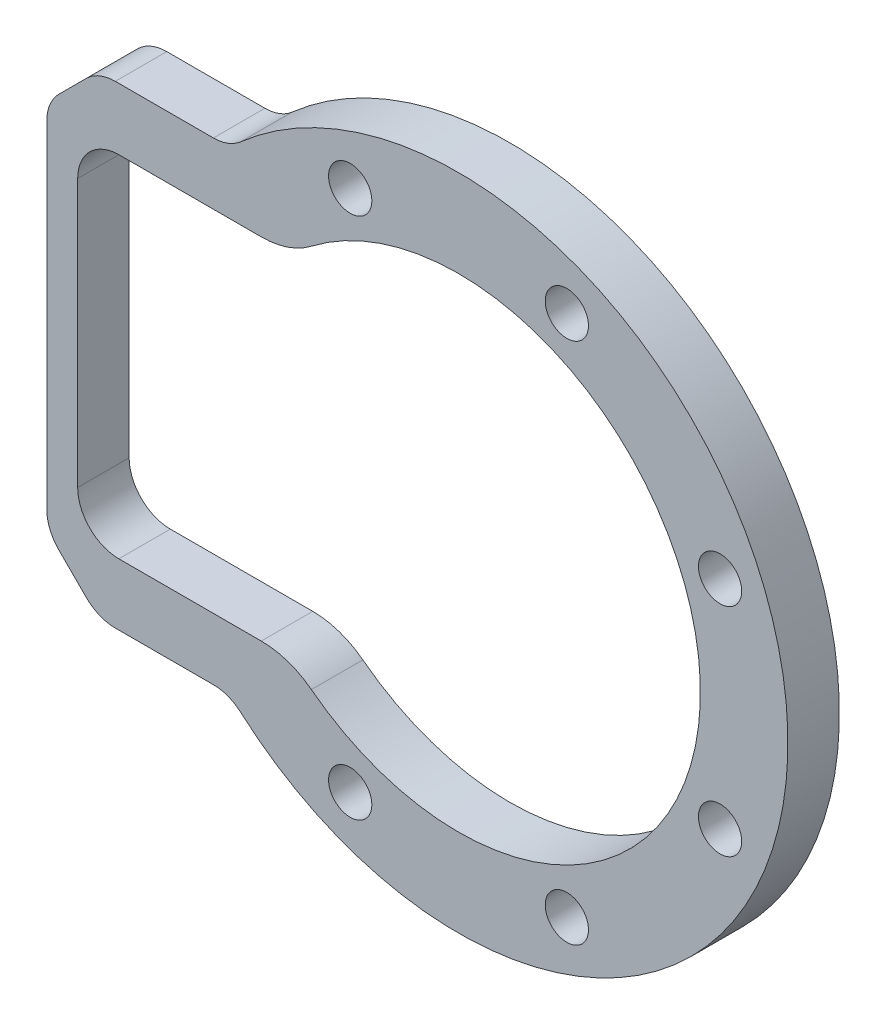
ISO-10303-21;
HEADER;
FILE_DESCRIPTION(('STEP AP214'),'2;1');
FILE_NAME('part.step','',(''),(''),'','','');
FILE_SCHEMA(('AUTOMOTIVE_DESIGN { 1 0 10303 214 1 1 1 1 }'));
ENDSEC;
DATA;
#1=APPLICATION_CONTEXT('core data for automotive mechanical design processes');
#2=APPLICATION_PROTOCOL_DEFINITION('international standard','automotive_design',2000,#1);
#3=PRODUCT_CONTEXT('',#1,'mechanical');
#4=PRODUCT('Part','Part','',(#3));
#5=PRODUCT_RELATED_PRODUCT_CATEGORY('part','',(#4));
#6=PRODUCT_DEFINITION_FORMATION('','',#4);
#7=PRODUCT_DEFINITION_CONTEXT('part definition',#1,'design');
#8=PRODUCT_DEFINITION('design','',#6,#7);
#9=PRODUCT_DEFINITION_SHAPE('','',#8);
#10=(LENGTH_UNIT() NAMED_UNIT(*) SI_UNIT(.MILLI.,.METRE.));
#11=(NAMED_UNIT(*) PLANE_ANGLE_UNIT() SI_UNIT($,.RADIAN.));
#12=(NAMED_UNIT(*) SI_UNIT($,.STERADIAN.) SOLID_ANGLE_UNIT());
#13=UNCERTAINTY_MEASURE_WITH_UNIT(LENGTH_MEASURE(1.E-05),#10,'distance_accuracy_value','');
#14=(GEOMETRIC_REPRESENTATION_CONTEXT(3) GLOBAL_UNCERTAINTY_ASSIGNED_CONTEXT((#13)) GLOBAL_UNIT_ASSIGNED_CONTEXT((#10,
#11,#12)) REPRESENTATION_CONTEXT('',''));
#15=CARTESIAN_POINT('',(0.,0.,0.));
#16=DIRECTION('',(0.,0.,1.));
#17=DIRECTION('',(1.,0.,0.));
#18=AXIS2_PLACEMENT_3D('',#15,#16,#17);
#19=CARTESIAN_POINT('',(-19.1637678967368,-25.,5.));
#20=DIRECTION('',(0.,0.,-1.));
#21=DIRECTION('',(-1.,0.,0.));
#22=AXIS2_PLACEMENT_3D('',#19,#20,#21);
#23=CYLINDRICAL_SURFACE('',#22,8.);
#24=CARTESIAN_POINT('',(-19.1637678967368,-25.,5.));
#25=DIRECTION('',(0.,0.,1.));
#26=DIRECTION('',(1.,0.,0.));
#27=AXIS2_PLACEMENT_3D('',#24,#25,#26);
#28=CIRCLE('',#27,8.);
#29=CARTESIAN_POINT('',(-14.2967792245497,-18.6507936507937,5.));
#30=VERTEX_POINT('',#29);
#31=CARTESIAN_POINT('',(-19.1637678967368,-17.,5.));
#32=VERTEX_POINT('',#31);
#33=EDGE_CURVE('E246',#30,#32,#28,.T.);
#34=ORIENTED_EDGE('',*,*,#33,.F.);
#35=DIRECTION('',(0.,0.,1.));
#36=VECTOR('',#35,1.);
#37=CARTESIAN_POINT('',(-14.2967792245497,-18.6507936507937,5.));
#38=LINE('',#37,#36);
#39=CARTESIAN_POINT('',(-14.2967792245497,-18.6507936507937,0.));
#40=VERTEX_POINT('',#39);
#41=EDGE_CURVE('E453',#40,#30,#38,.T.);
#42=ORIENTED_EDGE('',*,*,#41,.F.);
#43=CARTESIAN_POINT('',(-19.1637678967368,-25.,0.));
#44=DIRECTION('',(0.,0.,-1.));
#45=DIRECTION('',(1.,0.,0.));
#46=AXIS2_PLACEMENT_3D('',#43,#44,#45);
#47=CIRCLE('',#46,8.);
#48=CARTESIAN_POINT('',(-19.1637678967368,-17.,0.));
#49=VERTEX_POINT('',#48);
#50=EDGE_CURVE('E289',#49,#40,#47,.T.);
#51=ORIENTED_EDGE('',*,*,#50,.F.);
#52=DIRECTION('',(0.,0.,-1.));
#53=VECTOR('',#52,1.);
#54=CARTESIAN_POINT('',(-19.1637678967368,-17.,0.));
#55=LINE('',#54,#53);
#56=EDGE_CURVE('E437',#32,#49,#55,.T.);
#57=ORIENTED_EDGE('',*,*,#56,.F.);
#58=EDGE_LOOP('',(#34,#42,#51,#57));
#59=FACE_BOUND('',#58,.T.);
#60=ADVANCED_FACE('F16',(#59),#23,.T.);
#61=CARTESIAN_POINT('',(-19.1637678967368,25.,5.));
#62=DIRECTION('',(0.,0.,-1.));
#63=DIRECTION('',(-1.,0.,0.));
#64=AXIS2_PLACEMENT_3D('',#61,#62,#63);
#65=CYLINDRICAL_SURFACE('',#64,8.);
#66=CARTESIAN_POINT('',(-19.1637678967368,25.,5.));
#67=DIRECTION('',(0.,0.,1.));
#68=DIRECTION('',(1.,0.,0.));
#69=AXIS2_PLACEMENT_3D('',#66,#67,#68);
#70=CIRCLE('',#69,8.);
#71=CARTESIAN_POINT('',(-19.1637678967368,17.,5.));
#72=VERTEX_POINT('',#71);
#73=CARTESIAN_POINT('',(-14.2967792245497,18.6507936507937,5.));
#74=VERTEX_POINT('',#73);
#75=EDGE_CURVE('E242',#72,#74,#70,.T.);
#76=ORIENTED_EDGE('',*,*,#75,.F.);
#77=DIRECTION('',(0.,0.,1.));
#78=VECTOR('',#77,1.);
#79=CARTESIAN_POINT('',(-19.1637678967368,17.,5.));
#80=LINE('',#79,#78);
#81=CARTESIAN_POINT('',(-19.1637678967368,17.,0.));
#82=VERTEX_POINT('',#81);
#83=EDGE_CURVE('E350',#82,#72,#80,.T.);
#84=ORIENTED_EDGE('',*,*,#83,.F.);
#85=CARTESIAN_POINT('',(-19.1637678967368,25.,0.));
#86=DIRECTION('',(0.,0.,-1.));
#87=DIRECTION('',(1.,0.,0.));
#88=AXIS2_PLACEMENT_3D('',#85,#86,#87);
#89=CIRCLE('',#88,8.);
#90=CARTESIAN_POINT('',(-14.2967792245497,18.6507936507937,0.));
#91=VERTEX_POINT('',#90);
#92=EDGE_CURVE('E285',#91,#82,#89,.T.);
#93=ORIENTED_EDGE('',*,*,#92,.F.);
#94=DIRECTION('',(0.,0.,-1.));
#95=VECTOR('',#94,1.);
#96=CARTESIAN_POINT('',(-14.2967792245497,18.6507936507937,5.));
#97=LINE('',#96,#95);
#98=EDGE_CURVE('E467',#74,#91,#97,.T.);
#99=ORIENTED_EDGE('',*,*,#98,.F.);
#100=EDGE_LOOP('',(#76,#84,#93,#99));
#101=FACE_BOUND('',#100,.T.);
#102=ADVANCED_FACE('F1004',(#101),#65,.T.);
#103=CARTESIAN_POINT('',(-33.3431457505076,19.,5.));
#104=DIRECTION('',(0.,0.,1.));
#105=DIRECTION('',(1.,0.,0.));
#106=AXIS2_PLACEMENT_3D('',#103,#104,#105);
#107=CYLINDRICAL_SURFACE('',#106,4.);
#108=CARTESIAN_POINT('',(-33.3431457505076,19.,0.));
#109=DIRECTION('',(0.,0.,-1.));
#110=DIRECTION('',(1.,0.,0.));
#111=AXIS2_PLACEMENT_3D('',#108,#109,#110);
#112=CIRCLE('',#111,4.);
#113=CARTESIAN_POINT('',(-36.1715728752538,21.8284271247462,0.));
#114=VERTEX_POINT('',#113);
#115=CARTESIAN_POINT('',(-33.3431457505076,23.,0.));
#116=VERTEX_POINT('',#115);
#117=EDGE_CURVE('E261',#114,#116,#112,.T.);
#118=ORIENTED_EDGE('',*,*,#117,.F.);
#119=DIRECTION('',(0.,0.,-1.));
#120=VECTOR('',#119,1.);
#121=CARTESIAN_POINT('',(-36.1715728752538,21.8284271247462,0.));
#122=LINE('',#121,#120);
#123=CARTESIAN_POINT('',(-36.1715728752538,21.8284271247462,5.));
#124=VERTEX_POINT('',#123);
#125=EDGE_CURVE('E11',#124,#114,#122,.T.);
#126=ORIENTED_EDGE('',*,*,#125,.F.);
#127=CARTESIAN_POINT('',(-33.3431457505076,19.,5.));
#128=DIRECTION('',(0.,0.,1.));
#129=DIRECTION('',(1.,0.,0.));
#130=AXIS2_PLACEMENT_3D('',#127,#128,#129);
#131=CIRCLE('',#130,4.);
#132=CARTESIAN_POINT('',(-33.3431457505076,23.,5.));
#133=VERTEX_POINT('',#132);
#134=EDGE_CURVE('E312',#133,#124,#131,.T.);
#135=ORIENTED_EDGE('',*,*,#134,.F.);
#136=DIRECTION('',(0.,0.,1.));
#137=VECTOR('',#136,1.);
#138=CARTESIAN_POINT('',(-33.3431457505076,23.,5.));
#139=LINE('',#138,#137);
#140=EDGE_CURVE('E376',#116,#133,#139,.T.);
#141=ORIENTED_EDGE('',*,*,#140,.F.);
#142=EDGE_LOOP('',(#118,#126,#135,#141));
#143=FACE_BOUND('',#142,.T.);
#144=ADVANCED_FACE('F512',(#143),#107,.T.);
#145=CARTESIAN_POINT('',(-33.3431457505076,-19.,5.));
#146=DIRECTION('',(0.,0.,-1.));
#147=DIRECTION('',(-1.,0.,0.));
#148=AXIS2_PLACEMENT_3D('',#145,#146,#147);
#149=CYLINDRICAL_SURFACE('',#148,4.);
#150=CARTESIAN_POINT('',(-33.3431457505076,-19.,5.));
#151=DIRECTION('',(0.,0.,1.));
#152=DIRECTION('',(1.,0.,0.));
#153=AXIS2_PLACEMENT_3D('',#150,#151,#152);
#154=CIRCLE('',#153,4.);
#155=CARTESIAN_POINT('',(-36.1715728752539,-21.8284271247462,5.));
#156=VERTEX_POINT('',#155);
#157=CARTESIAN_POINT('',(-33.3431457505076,-23.,5.));
#158=VERTEX_POINT('',#157);
#159=EDGE_CURVE('E324',#156,#158,#154,.T.);
#160=ORIENTED_EDGE('',*,*,#159,.F.);
#161=DIRECTION('',(0.,0.,1.));
#162=VECTOR('',#161,1.);
#163=CARTESIAN_POINT('',(-36.1715728752539,-21.8284271247462,5.));
#164=LINE('',#163,#162);
#165=CARTESIAN_POINT('',(-36.1715728752539,-21.8284271247462,0.));
#166=VERTEX_POINT('',#165);
#167=EDGE_CURVE('E19',#166,#156,#164,.T.);
#168=ORIENTED_EDGE('',*,*,#167,.F.);
#169=CARTESIAN_POINT('',(-33.3431457505076,-19.,0.));
#170=DIRECTION('',(0.,0.,-1.));
#171=DIRECTION('',(1.,0.,0.));
#172=AXIS2_PLACEMENT_3D('',#169,#170,#171);
#173=CIRCLE('',#172,4.);
#174=CARTESIAN_POINT('',(-33.3431457505076,-23.,0.));
#175=VERTEX_POINT('',#174);
#176=EDGE_CURVE('E265',#175,#166,#173,.T.);
#177=ORIENTED_EDGE('',*,*,#176,.F.);
#178=DIRECTION('',(0.,0.,-1.));
#179=VECTOR('',#178,1.);
#180=CARTESIAN_POINT('',(-33.3431457505076,-23.,0.));
#181=LINE('',#180,#179);
#182=EDGE_CURVE('E401',#158,#175,#181,.T.);
#183=ORIENTED_EDGE('',*,*,#182,.F.);
#184=EDGE_LOOP('',(#160,#168,#177,#183));
#185=FACE_BOUND('',#184,.T.);
#186=ADVANCED_FACE('F534',(#185),#149,.T.);
#187=CARTESIAN_POINT('',(-36.,-16.3431457505076,5.));
#188=DIRECTION('',(0.,0.,1.));
#189=DIRECTION('',(1.,0.,0.));
#190=AXIS2_PLACEMENT_3D('',#187,#188,#189);
#191=CYLINDRICAL_SURFACE('',#190,4.);
#192=CARTESIAN_POINT('',(-36.,-16.3431457505076,0.));
#193=DIRECTION('',(0.,0.,-1.));
#194=DIRECTION('',(1.,0.,0.));
#195=AXIS2_PLACEMENT_3D('',#192,#193,#194);
#196=CIRCLE('',#195,4.);
#197=CARTESIAN_POINT('',(-38.8284271247462,-19.1715728752538,0.));
#198=VERTEX_POINT('',#197);
#199=CARTESIAN_POINT('',(-40.,-16.3431457505076,0.));
#200=VERTEX_POINT('',#199);
#201=EDGE_CURVE('E274',#198,#200,#196,.T.);
#202=ORIENTED_EDGE('',*,*,#201,.F.);
#203=DIRECTION('',(0.,0.,-1.));
#204=VECTOR('',#203,1.);
#205=CARTESIAN_POINT('',(-38.8284271247462,-19.1715728752538,0.));
#206=LINE('',#205,#204);
#207=CARTESIAN_POINT('',(-38.8284271247462,-19.1715728752538,5.));
#208=VERTEX_POINT('',#207);
#209=EDGE_CURVE('E292',#208,#198,#206,.T.);
#210=ORIENTED_EDGE('',*,*,#209,.F.);
#211=CARTESIAN_POINT('',(-36.,-16.3431457505076,5.));
#212=DIRECTION('',(0.,0.,1.));
#213=DIRECTION('',(1.,0.,0.));
#214=AXIS2_PLACEMENT_3D('',#211,#212,#213);
#215=CIRCLE('',#214,4.);
#216=CARTESIAN_POINT('',(-40.,-16.3431457505076,5.));
#217=VERTEX_POINT('',#216);
#218=EDGE_CURVE('E330',#217,#208,#215,.T.);
#219=ORIENTED_EDGE('',*,*,#218,.F.);
#220=DIRECTION('',(0.,0.,1.));
#221=VECTOR('',#220,1.);
#222=CARTESIAN_POINT('',(-40.,-16.3431457505076,5.));
#223=LINE('',#222,#221);
#224=EDGE_CURVE('E351',#200,#217,#223,.T.);
#225=ORIENTED_EDGE('',*,*,#224,.F.);
#226=EDGE_LOOP('',(#202,#210,#219,#225));
#227=FACE_BOUND('',#226,.T.);
#228=ADVANCED_FACE('F497',(#227),#191,.T.);
#229=CARTESIAN_POINT('',(-36.,16.3431457505076,5.));
#230=DIRECTION('',(0.,0.,-1.));
#231=DIRECTION('',(-1.,0.,0.));
#232=AXIS2_PLACEMENT_3D('',#229,#230,#231);
#233=CYLINDRICAL_SURFACE('',#232,4.);
#234=CARTESIAN_POINT('',(-36.,16.3431457505076,5.));
#235=DIRECTION('',(0.,0.,1.));
#236=DIRECTION('',(1.,0.,0.));
#237=AXIS2_PLACEMENT_3D('',#234,#235,#236);
#238=CIRCLE('',#237,4.);
#239=CARTESIAN_POINT('',(-38.8284271247462,19.1715728752538,5.));
#240=VERTEX_POINT('',#239);
#241=CARTESIAN_POINT('',(-40.,16.3431457505076,5.));
#242=VERTEX_POINT('',#241);
#243=EDGE_CURVE('E334',#240,#242,#238,.T.);
#244=ORIENTED_EDGE('',*,*,#243,.F.);
#245=DIRECTION('',(0.,0.,1.));
#246=VECTOR('',#245,1.);
#247=CARTESIAN_POINT('',(-38.8284271247462,19.1715728752538,5.));
#248=LINE('',#247,#246);
#249=CARTESIAN_POINT('',(-38.8284271247462,19.1715728752538,0.));
#250=VERTEX_POINT('',#249);
#251=EDGE_CURVE('E26',#250,#240,#248,.T.);
#252=ORIENTED_EDGE('',*,*,#251,.F.);
#253=CARTESIAN_POINT('',(-36.,16.3431457505076,0.));
#254=DIRECTION('',(0.,0.,-1.));
#255=DIRECTION('',(1.,0.,0.));
#256=AXIS2_PLACEMENT_3D('',#253,#254,#255);
#257=CIRCLE('',#256,4.);
#258=CARTESIAN_POINT('',(-40.,16.3431457505076,0.));
#259=VERTEX_POINT('',#258);
#260=EDGE_CURVE('E252',#259,#250,#257,.T.);
#261=ORIENTED_EDGE('',*,*,#260,.F.);
#262=DIRECTION('',(0.,0.,-1.));
#263=VECTOR('',#262,1.);
#264=CARTESIAN_POINT('',(-40.,16.3431457505076,0.));
#265=LINE('',#264,#263);
#266=EDGE_CURVE('E360',#242,#259,#265,.T.);
#267=ORIENTED_EDGE('',*,*,#266,.F.);
#268=EDGE_LOOP('',(#244,#252,#261,#267));
#269=FACE_BOUND('',#268,.T.);
#270=ADVANCED_FACE('F505',(#269),#233,.T.);
#271=CARTESIAN_POINT('',(-33.,13.,5.));
#272=DIRECTION('',(0.,0.,1.));
#273=DIRECTION('',(1.,0.,0.));
#274=AXIS2_PLACEMENT_3D('',#271,#272,#273);
#275=CYLINDRICAL_SURFACE('',#274,4.);
#276=CARTESIAN_POINT('',(-33.,13.,5.));
#277=DIRECTION('',(0.,0.,-1.));
#278=DIRECTION('',(1.,0.,0.));
#279=AXIS2_PLACEMENT_3D('',#276,#277,#278);
#280=CIRCLE('',#279,4.);
#281=CARTESIAN_POINT('',(-37.,13.,5.));
#282=VERTEX_POINT('',#281);
#283=CARTESIAN_POINT('',(-33.,17.,5.));
#284=VERTEX_POINT('',#283);
#285=EDGE_CURVE('E249',#282,#284,#280,.T.);
#286=ORIENTED_EDGE('',*,*,#285,.F.);
#287=DIRECTION('',(0.,0.,1.));
#288=VECTOR('',#287,1.);
#289=CARTESIAN_POINT('',(-37.,13.,5.));
#290=LINE('',#289,#288);
#291=CARTESIAN_POINT('',(-37.,13.,0.));
#292=VERTEX_POINT('',#291);
#293=EDGE_CURVE('E418',#292,#282,#290,.T.);
#294=ORIENTED_EDGE('',*,*,#293,.F.);
#295=CARTESIAN_POINT('',(-33.,13.,0.));
#296=DIRECTION('',(0.,0.,1.));
#297=DIRECTION('',(1.,0.,0.));
#298=AXIS2_PLACEMENT_3D('',#295,#296,#297);
#299=CIRCLE('',#298,4.);
#300=CARTESIAN_POINT('',(-33.,17.,0.));
#301=VERTEX_POINT('',#300);
#302=EDGE_CURVE('E286',#301,#292,#299,.T.);
#303=ORIENTED_EDGE('',*,*,#302,.F.);
#304=DIRECTION('',(0.,0.,-1.));
#305=VECTOR('',#304,1.);
#306=CARTESIAN_POINT('',(-33.,17.,0.));
#307=LINE('',#306,#305);
#308=EDGE_CURVE('E342',#284,#301,#307,.T.);
#309=ORIENTED_EDGE('',*,*,#308,.F.);
#310=EDGE_LOOP('',(#286,#294,#303,#309));
#311=FACE_BOUND('',#310,.T.);
#312=ADVANCED_FACE('F966',(#311),#275,.F.);
#313=CARTESIAN_POINT('',(-33.,-13.,5.));
#314=DIRECTION('',(0.,0.,-1.));
#315=DIRECTION('',(-1.,0.,0.));
#316=AXIS2_PLACEMENT_3D('',#313,#314,#315);
#317=CYLINDRICAL_SURFACE('',#316,4.);
#318=CARTESIAN_POINT('',(-33.,-13.,5.));
#319=DIRECTION('',(0.,0.,-1.));
#320=DIRECTION('',(1.,0.,0.));
#321=AXIS2_PLACEMENT_3D('',#318,#319,#320);
#322=CIRCLE('',#321,4.);
#323=CARTESIAN_POINT('',(-33.,-17.,5.));
#324=VERTEX_POINT('',#323);
#325=CARTESIAN_POINT('',(-37.,-13.,5.));
#326=VERTEX_POINT('',#325);
#327=EDGE_CURVE('E253',#324,#326,#322,.T.);
#328=ORIENTED_EDGE('',*,*,#327,.F.);
#329=DIRECTION('',(0.,0.,1.));
#330=VECTOR('',#329,1.);
#331=CARTESIAN_POINT('',(-33.,-17.,5.));
#332=LINE('',#331,#330);
#333=CARTESIAN_POINT('',(-33.,-17.,0.));
#334=VERTEX_POINT('',#333);
#335=EDGE_CURVE('E414',#334,#324,#332,.T.);
#336=ORIENTED_EDGE('',*,*,#335,.F.);
#337=CARTESIAN_POINT('',(-33.,-13.,0.));
#338=DIRECTION('',(0.,0.,1.));
#339=DIRECTION('',(1.,0.,0.));
#340=AXIS2_PLACEMENT_3D('',#337,#338,#339);
#341=CIRCLE('',#340,4.);
#342=CARTESIAN_POINT('',(-37.,-13.,0.));
#343=VERTEX_POINT('',#342);
#344=EDGE_CURVE('E288',#343,#334,#341,.T.);
#345=ORIENTED_EDGE('',*,*,#344,.F.);
#346=DIRECTION('',(0.,0.,-1.));
#347=VECTOR('',#346,1.);
#348=CARTESIAN_POINT('',(-37.,-13.,5.));
#349=LINE('',#348,#347);
#350=EDGE_CURVE('E402',#326,#343,#349,.T.);
#351=ORIENTED_EDGE('',*,*,#350,.F.);
#352=EDGE_LOOP('',(#328,#336,#345,#351));
#353=FACE_BOUND('',#352,.T.);
#354=ADVANCED_FACE('F958',(#353),#317,.F.);
#355=CARTESIAN_POINT('',(-23.8117617995814,27.,5.));
#356=DIRECTION('',(0.,0.,-1.));
#357=DIRECTION('',(-1.,0.,0.));
#358=AXIS2_PLACEMENT_3D('',#355,#356,#357);
#359=CYLINDRICAL_SURFACE('',#358,4.);
#360=CARTESIAN_POINT('',(-23.8117617995814,27.,5.));
#361=DIRECTION('',(0.,0.,-1.));
#362=DIRECTION('',(1.,0.,0.));
#363=AXIS2_PLACEMENT_3D('',#360,#361,#362);
#364=CIRCLE('',#363,4.);
#365=CARTESIAN_POINT('',(-21.1660104885168,24.,5.));
#366=VERTEX_POINT('',#365);
#367=CARTESIAN_POINT('',(-23.8117617995814,23.,5.));
#368=VERTEX_POINT('',#367);
#369=EDGE_CURVE('E316',#366,#368,#364,.T.);
#370=ORIENTED_EDGE('',*,*,#369,.F.);
#371=DIRECTION('',(0.,0.,1.));
#372=VECTOR('',#371,1.);
#373=CARTESIAN_POINT('',(-21.1660104885168,24.,5.));
#374=LINE('',#373,#372);
#375=CARTESIAN_POINT('',(-21.1660104885168,24.,0.));
#376=VERTEX_POINT('',#375);
#377=EDGE_CURVE('E381',#376,#366,#374,.T.);
#378=ORIENTED_EDGE('',*,*,#377,.F.);
#379=CARTESIAN_POINT('',(-23.8117617995814,27.,0.));
#380=DIRECTION('',(0.,0.,1.));
#381=DIRECTION('',(1.,0.,0.));
#382=AXIS2_PLACEMENT_3D('',#379,#380,#381);
#383=CIRCLE('',#382,4.);
#384=CARTESIAN_POINT('',(-23.8117617995814,23.,0.));
#385=VERTEX_POINT('',#384);
#386=EDGE_CURVE('E264',#385,#376,#383,.T.);
#387=ORIENTED_EDGE('',*,*,#386,.F.);
#388=DIRECTION('',(0.,0.,-1.));
#389=VECTOR('',#388,1.);
#390=CARTESIAN_POINT('',(-23.8117617995814,23.,0.));
#391=LINE('',#390,#389);
#392=EDGE_CURVE('E368',#368,#385,#391,.T.);
#393=ORIENTED_EDGE('',*,*,#392,.F.);
#394=EDGE_LOOP('',(#370,#378,#387,#393));
#395=FACE_BOUND('',#394,.T.);
#396=ADVANCED_FACE('F521',(#395),#359,.F.);
#397=CARTESIAN_POINT('',(-23.8117617995813,-27.,5.));
#398=DIRECTION('',(0.,0.,-1.));
#399=DIRECTION('',(-1.,0.,0.));
#400=AXIS2_PLACEMENT_3D('',#397,#398,#399);
#401=CYLINDRICAL_SURFACE('',#400,4.);
#402=CARTESIAN_POINT('',(-23.8117617995813,-27.,5.));
#403=DIRECTION('',(0.,0.,-1.));
#404=DIRECTION('',(1.,0.,0.));
#405=AXIS2_PLACEMENT_3D('',#402,#403,#404);
#406=CIRCLE('',#405,4.);
#407=CARTESIAN_POINT('',(-23.8117617995813,-23.,5.));
#408=VERTEX_POINT('',#407);
#409=CARTESIAN_POINT('',(-21.1660104885168,-24.,5.));
#410=VERTEX_POINT('',#409);
#411=EDGE_CURVE('E321',#408,#410,#406,.T.);
#412=ORIENTED_EDGE('',*,*,#411,.F.);
#413=DIRECTION('',(0.,0.,1.));
#414=VECTOR('',#413,1.);
#415=CARTESIAN_POINT('',(-23.8117617995813,-23.,5.));
#416=LINE('',#415,#414);
#417=CARTESIAN_POINT('',(-23.8117617995813,-23.,0.));
#418=VERTEX_POINT('',#417);
#419=EDGE_CURVE('E396',#418,#408,#416,.T.);
#420=ORIENTED_EDGE('',*,*,#419,.F.);
#421=CARTESIAN_POINT('',(-23.8117617995813,-27.,0.));
#422=DIRECTION('',(0.,0.,1.));
#423=DIRECTION('',(1.,0.,0.));
#424=AXIS2_PLACEMENT_3D('',#421,#422,#423);
#425=CIRCLE('',#424,4.);
#426=CARTESIAN_POINT('',(-21.1660104885168,-24.,0.));
#427=VERTEX_POINT('',#426);
#428=EDGE_CURVE('E270',#427,#418,#425,.T.);
#429=ORIENTED_EDGE('',*,*,#428,.F.);
#430=DIRECTION('',(0.,0.,-1.));
#431=VECTOR('',#430,1.);
#432=CARTESIAN_POINT('',(-21.1660104885168,-24.,5.));
#433=LINE('',#432,#431);
#434=EDGE_CURVE('E386',#410,#427,#433,.T.);
#435=ORIENTED_EDGE('',*,*,#434,.F.);
#436=EDGE_LOOP('',(#412,#420,#429,#435));
#437=FACE_BOUND('',#436,.T.);
#438=ADVANCED_FACE('F528',(#437),#401,.F.);
#439=CARTESIAN_POINT('',(-40.,18.,5.));
#440=DIRECTION('',(0.707106781186546,-0.707106781186549,0.));
#441=DIRECTION('',(0.,0.,-1.));
#442=AXIS2_PLACEMENT_3D('',#439,#440,#441);
#443=PLANE('',#442);
#444=DIRECTION('',(0.707106781186549,0.707106781186546,0.));
#445=VECTOR('',#444,1.);
#446=CARTESIAN_POINT('',(-40.,18.,0.));
#447=LINE('',#446,#445);
#448=EDGE_CURVE('E257',#250,#114,#447,.T.);
#449=ORIENTED_EDGE('',*,*,#448,.F.);
#450=ORIENTED_EDGE('',*,*,#251,.T.);
#451=DIRECTION('',(-0.707106781186549,-0.707106781186546,0.));
#452=VECTOR('',#451,1.);
#453=CARTESIAN_POINT('',(-29.,29.,5.));
#454=LINE('',#453,#452);
#455=EDGE_CURVE('E338',#124,#240,#454,.T.);
#456=ORIENTED_EDGE('',*,*,#455,.F.);
#457=ORIENTED_EDGE('',*,*,#125,.T.);
#458=EDGE_LOOP('',(#449,#450,#456,#457));
#459=FACE_BOUND('',#458,.T.);
#460=ADVANCED_FACE('F508',(#459),#443,.F.);
#461=CARTESIAN_POINT('',(-35.,-23.,5.));
#462=DIRECTION('',(0.707106781186549,0.707106781186546,0.));
#463=DIRECTION('',(0.,0.,-1.));
#464=AXIS2_PLACEMENT_3D('',#461,#462,#463);
#465=PLANE('',#464);
#466=DIRECTION('',(0.707106781186546,-0.707106781186549,0.));
#467=VECTOR('',#466,1.);
#468=CARTESIAN_POINT('',(-29.,-29.,5.));
#469=LINE('',#468,#467);
#470=EDGE_CURVE('E327',#208,#156,#469,.T.);
#471=ORIENTED_EDGE('',*,*,#470,.F.);
#472=ORIENTED_EDGE('',*,*,#209,.T.);
#473=DIRECTION('',(-0.707106781186546,0.707106781186549,0.));
#474=VECTOR('',#473,1.);
#475=CARTESIAN_POINT('',(-35.,-23.,0.));
#476=LINE('',#475,#474);
#477=EDGE_CURVE('E269',#166,#198,#476,.T.);
#478=ORIENTED_EDGE('',*,*,#477,.F.);
#479=ORIENTED_EDGE('',*,*,#167,.T.);
#480=EDGE_LOOP('',(#471,#472,#478,#479));
#481=FACE_BOUND('',#480,.T.);
#482=ADVANCED_FACE('F494',(#481),#465,.F.);
#483=CARTESIAN_POINT('',(-10.52379439004,-25.4066871440604,5.));
#484=DIRECTION('',(0.,0.,-1.));
#485=DIRECTION('',(-1.,0.,0.));
#486=AXIS2_PLACEMENT_3D('',#483,#484,#485);
#487=CYLINDRICAL_SURFACE('',#486,2.1);
#488=CARTESIAN_POINT('',(-10.52379439004,-25.4066871440604,5.));
#489=DIRECTION('',(0.,0.,-1.));
#490=DIRECTION('',(-1.,0.,0.));
#491=AXIS2_PLACEMENT_3D('',#488,#489,#490);
#492=CIRCLE('',#491,2.1);
#493=CARTESIAN_POINT('',(-12.62379439004,-25.4066871440604,5.));
#494=VERTEX_POINT('',#493);
#495=EDGE_CURVE('E228',#494,#494,#492,.T.);
#496=ORIENTED_EDGE('',*,*,#495,.F.);
#497=EDGE_LOOP('',(#496));
#498=FACE_BOUND('',#497,.T.);
#499=CARTESIAN_POINT('',(-10.52379439004,-25.4066871440604,0.));
#500=DIRECTION('',(0.,0.,-1.));
#501=DIRECTION('',(-1.,0.,0.));
#502=AXIS2_PLACEMENT_3D('',#499,#500,#501);
#503=CIRCLE('',#502,2.1);
#504=CARTESIAN_POINT('',(-12.62379439004,-25.4066871440604,0.));
#505=VERTEX_POINT('',#504);
#506=EDGE_CURVE('E72',#505,#505,#503,.T.);
#507=ORIENTED_EDGE('',*,*,#506,.T.);
#508=EDGE_LOOP('',(#507));
#509=FACE_BOUND('',#508,.T.);
#510=ADVANCED_FACE('F832',(#498,#509),#487,.F.);
#511=CARTESIAN_POINT('',(10.52379439004,-25.4066871440604,5.));
#512=DIRECTION('',(0.,0.,-1.));
#513=DIRECTION('',(-1.,0.,0.));
#514=AXIS2_PLACEMENT_3D('',#511,#512,#513);
#515=CYLINDRICAL_SURFACE('',#514,2.1);
#516=CARTESIAN_POINT('',(10.52379439004,-25.4066871440604,5.));
#517=DIRECTION('',(0.,0.,-1.));
#518=DIRECTION('',(-1.,0.,0.));
#519=AXIS2_PLACEMENT_3D('',#516,#517,#518);
#520=CIRCLE('',#519,2.1);
#521=CARTESIAN_POINT('',(8.42379439003997,-25.4066871440604,5.));
#522=VERTEX_POINT('',#521);
#523=EDGE_CURVE('E209',#522,#522,#520,.T.);
#524=ORIENTED_EDGE('',*,*,#523,.F.);
#525=EDGE_LOOP('',(#524));
#526=FACE_BOUND('',#525,.T.);
#527=CARTESIAN_POINT('',(10.52379439004,-25.4066871440604,0.));
#528=DIRECTION('',(0.,0.,-1.));
#529=DIRECTION('',(-1.,0.,0.));
#530=AXIS2_PLACEMENT_3D('',#527,#528,#529);
#531=CIRCLE('',#530,2.1);
#532=CARTESIAN_POINT('',(8.42379439003997,-25.4066871440604,0.));
#533=VERTEX_POINT('',#532);
#534=EDGE_CURVE('E80',#533,#533,#531,.T.);
#535=ORIENTED_EDGE('',*,*,#534,.T.);
#536=EDGE_LOOP('',(#535));
#537=FACE_BOUND('',#536,.T.);
#538=ADVANCED_FACE('F836',(#526,#537),#515,.F.);
#539=CARTESIAN_POINT('',(25.4066871440604,-10.52379439004,5.));
#540=DIRECTION('',(0.,0.,-1.));
#541=DIRECTION('',(-1.,0.,0.));
#542=AXIS2_PLACEMENT_3D('',#539,#540,#541);
#543=CYLINDRICAL_SURFACE('',#542,2.1);
#544=CARTESIAN_POINT('',(25.4066871440604,-10.52379439004,5.));
#545=DIRECTION('',(0.,0.,-1.));
#546=DIRECTION('',(-1.,0.,0.));
#547=AXIS2_PLACEMENT_3D('',#544,#545,#546);
#548=CIRCLE('',#547,2.1);
#549=CARTESIAN_POINT('',(23.3066871440604,-10.52379439004,5.));
#550=VERTEX_POINT('',#549);
#551=EDGE_CURVE('E215',#550,#550,#548,.T.);
#552=ORIENTED_EDGE('',*,*,#551,.F.);
#553=EDGE_LOOP('',(#552));
#554=FACE_BOUND('',#553,.T.);
#555=CARTESIAN_POINT('',(25.4066871440604,-10.52379439004,0.));
#556=DIRECTION('',(0.,0.,-1.));
#557=DIRECTION('',(-1.,0.,0.));
#558=AXIS2_PLACEMENT_3D('',#555,#556,#557);
#559=CIRCLE('',#558,2.1);
#560=CARTESIAN_POINT('',(23.3066871440604,-10.52379439004,0.));
#561=VERTEX_POINT('',#560);
#562=EDGE_CURVE('E90',#561,#561,#559,.T.);
#563=ORIENTED_EDGE('',*,*,#562,.T.);
#564=EDGE_LOOP('',(#563));
#565=FACE_BOUND('',#564,.T.);
#566=ADVANCED_FACE('F807',(#554,#565),#543,.F.);
#567=CARTESIAN_POINT('',(25.4066871440604,10.52379439004,5.));
#568=DIRECTION('',(0.,0.,-1.));
#569=DIRECTION('',(-1.,0.,0.));
#570=AXIS2_PLACEMENT_3D('',#567,#568,#569);
#571=CYLINDRICAL_SURFACE('',#570,2.1);
#572=CARTESIAN_POINT('',(25.4066871440604,10.52379439004,5.));
#573=DIRECTION('',(0.,0.,-1.));
#574=DIRECTION('',(-1.,0.,0.));
#575=AXIS2_PLACEMENT_3D('',#572,#573,#574);
#576=CIRCLE('',#575,2.1);
#577=CARTESIAN_POINT('',(23.3066871440604,10.52379439004,5.));
#578=VERTEX_POINT('',#577);
#579=EDGE_CURVE('E219',#578,#578,#576,.T.);
#580=ORIENTED_EDGE('',*,*,#579,.F.);
#581=EDGE_LOOP('',(#580));
#582=FACE_BOUND('',#581,.T.);
#583=CARTESIAN_POINT('',(25.4066871440604,10.52379439004,0.));
#584=DIRECTION('',(0.,0.,-1.));
#585=DIRECTION('',(-1.,0.,0.));
#586=AXIS2_PLACEMENT_3D('',#583,#584,#585);
#587=CIRCLE('',#586,2.1);
#588=CARTESIAN_POINT('',(23.3066871440604,10.52379439004,0.));
#589=VERTEX_POINT('',#588);
#590=EDGE_CURVE('E235',#589,#589,#587,.T.);
#591=ORIENTED_EDGE('',*,*,#590,.T.);
#592=EDGE_LOOP('',(#591));
#593=FACE_BOUND('',#592,.T.);
#594=ADVANCED_FACE('F802',(#582,#593),#571,.F.);
#595=CARTESIAN_POINT('',(10.52379439004,25.4066871440604,5.));
#596=DIRECTION('',(0.,0.,-1.));
#597=DIRECTION('',(-1.,0.,0.));
#598=AXIS2_PLACEMENT_3D('',#595,#596,#597);
#599=CYLINDRICAL_SURFACE('',#598,2.1);
#600=CARTESIAN_POINT('',(10.52379439004,25.4066871440604,5.));
#601=DIRECTION('',(0.,0.,-1.));
#602=DIRECTION('',(-1.,0.,0.));
#603=AXIS2_PLACEMENT_3D('',#600,#601,#602);
#604=CIRCLE('',#603,2.1);
#605=CARTESIAN_POINT('',(8.42379439003997,25.4066871440604,5.));
#606=VERTEX_POINT('',#605);
#607=EDGE_CURVE('E226',#606,#606,#604,.T.);
#608=ORIENTED_EDGE('',*,*,#607,.F.);
#609=EDGE_LOOP('',(#608));
#610=FACE_BOUND('',#609,.T.);
#611=CARTESIAN_POINT('',(10.52379439004,25.4066871440604,0.));
#612=DIRECTION('',(0.,0.,-1.));
#613=DIRECTION('',(-1.,0.,0.));
#614=AXIS2_PLACEMENT_3D('',#611,#612,#613);
#615=CIRCLE('',#614,2.1);
#616=CARTESIAN_POINT('',(8.42379439003997,25.4066871440604,0.));
#617=VERTEX_POINT('',#616);
#618=EDGE_CURVE('E232',#617,#617,#615,.T.);
#619=ORIENTED_EDGE('',*,*,#618,.T.);
#620=EDGE_LOOP('',(#619));
#621=FACE_BOUND('',#620,.T.);
#622=ADVANCED_FACE('F806',(#610,#621),#599,.F.);
#623=CARTESIAN_POINT('',(-10.52379439004,25.4066871440604,5.));
#624=DIRECTION('',(0.,0.,-1.));
#625=DIRECTION('',(-1.,0.,0.));
#626=AXIS2_PLACEMENT_3D('',#623,#624,#625);
#627=CYLINDRICAL_SURFACE('',#626,2.1);
#628=CARTESIAN_POINT('',(-10.52379439004,25.4066871440604,5.));
#629=DIRECTION('',(0.,0.,-1.));
#630=DIRECTION('',(-1.,0.,0.));
#631=AXIS2_PLACEMENT_3D('',#628,#629,#630);
#632=CIRCLE('',#631,2.1);
#633=CARTESIAN_POINT('',(-12.62379439004,25.4066871440604,5.));
#634=VERTEX_POINT('',#633);
#635=EDGE_CURVE('E238',#634,#634,#632,.T.);
#636=ORIENTED_EDGE('',*,*,#635,.F.);
#637=EDGE_LOOP('',(#636));
#638=FACE_BOUND('',#637,.T.);
#639=CARTESIAN_POINT('',(-10.52379439004,25.4066871440604,0.));
#640=DIRECTION('',(0.,0.,-1.));
#641=DIRECTION('',(-1.,0.,0.));
#642=AXIS2_PLACEMENT_3D('',#639,#640,#641);
#643=CIRCLE('',#642,2.1);
#644=CARTESIAN_POINT('',(-12.62379439004,25.4066871440604,0.));
#645=VERTEX_POINT('',#644);
#646=EDGE_CURVE('E39',#645,#645,#643,.T.);
#647=ORIENTED_EDGE('',*,*,#646,.T.);
#648=EDGE_LOOP('',(#647));
#649=FACE_BOUND('',#648,.T.);
#650=ADVANCED_FACE('F890',(#638,#649),#627,.F.);
#651=CARTESIAN_POINT('',(0.,0.,0.));
#652=DIRECTION('',(0.,0.,1.));
#653=DIRECTION('',(1.,0.,0.));
#654=AXIS2_PLACEMENT_3D('',#651,#652,#653);
#655=PLANE('',#654);
#656=CARTESIAN_POINT('',(0.,0.,0.));
#657=DIRECTION('',(0.,0.,1.));
#658=DIRECTION('',(1.,0.,0.));
#659=AXIS2_PLACEMENT_3D('',#656,#657,#658);
#660=CIRCLE('',#659,23.5);
#661=EDGE_CURVE('E461',#40,#91,#660,.T.);
#662=ORIENTED_EDGE('',*,*,#661,.T.);
#663=ORIENTED_EDGE('',*,*,#92,.T.);
#664=DIRECTION('',(-1.,0.,0.));
#665=VECTOR('',#664,1.);
#666=CARTESIAN_POINT('',(0.,17.,0.));
#667=LINE('',#666,#665);
#668=EDGE_CURVE('E355',#82,#301,#667,.T.);
#669=ORIENTED_EDGE('',*,*,#668,.T.);
#670=ORIENTED_EDGE('',*,*,#302,.T.);
#671=DIRECTION('',(0.,-1.,0.));
#672=VECTOR('',#671,1.);
#673=CARTESIAN_POINT('',(-37.,0.,0.));
#674=LINE('',#673,#672);
#675=EDGE_CURVE('E406',#292,#343,#674,.T.);
#676=ORIENTED_EDGE('',*,*,#675,.T.);
#677=ORIENTED_EDGE('',*,*,#344,.T.);
#678=DIRECTION('',(-1.,0.,0.));
#679=VECTOR('',#678,1.);
#680=CARTESIAN_POINT('',(0.,-17.,0.));
#681=LINE('',#680,#679);
#682=EDGE_CURVE('E429',#49,#334,#681,.T.);
#683=ORIENTED_EDGE('',*,*,#682,.F.);
#684=ORIENTED_EDGE('',*,*,#50,.T.);
#685=EDGE_LOOP('',(#662,#663,#669,#670,#676,#677,#683,#684));
#686=FACE_BOUND('',#685,.T.);
#687=ORIENTED_EDGE('',*,*,#646,.F.);
#688=EDGE_LOOP('',(#687));
#689=FACE_BOUND('',#688,.T.);
#690=ORIENTED_EDGE('',*,*,#618,.F.);
#691=EDGE_LOOP('',(#690));
#692=FACE_BOUND('',#691,.T.);
#693=ORIENTED_EDGE('',*,*,#590,.F.);
#694=EDGE_LOOP('',(#693));
#695=FACE_BOUND('',#694,.T.);
#696=ORIENTED_EDGE('',*,*,#562,.F.);
#697=EDGE_LOOP('',(#696));
#698=FACE_BOUND('',#697,.T.);
#699=ORIENTED_EDGE('',*,*,#534,.F.);
#700=EDGE_LOOP('',(#699));
#701=FACE_BOUND('',#700,.T.);
#702=ORIENTED_EDGE('',*,*,#506,.F.);
#703=EDGE_LOOP('',(#702));
#704=FACE_BOUND('',#703,.T.);
#705=DIRECTION('',(0.,-1.,0.));
#706=VECTOR('',#705,1.);
#707=CARTESIAN_POINT('',(-40.,0.,0.));
#708=LINE('',#707,#706);
#709=EDGE_CURVE('E356',#259,#200,#708,.T.);
#710=ORIENTED_EDGE('',*,*,#709,.F.);
#711=ORIENTED_EDGE('',*,*,#260,.T.);
#712=ORIENTED_EDGE('',*,*,#448,.T.);
#713=ORIENTED_EDGE('',*,*,#117,.T.);
#714=DIRECTION('',(-1.,0.,0.));
#715=VECTOR('',#714,1.);
#716=CARTESIAN_POINT('',(0.,23.,0.));
#717=LINE('',#716,#715);
#718=EDGE_CURVE('E380',#385,#116,#717,.T.);
#719=ORIENTED_EDGE('',*,*,#718,.F.);
#720=ORIENTED_EDGE('',*,*,#386,.T.);
#721=CARTESIAN_POINT('',(0.,0.,0.));
#722=DIRECTION('',(0.,0.,1.));
#723=DIRECTION('',(1.,0.,0.));
#724=AXIS2_PLACEMENT_3D('',#721,#722,#723);
#725=CIRCLE('',#724,32.);
#726=EDGE_CURVE('E385',#427,#376,#725,.T.);
#727=ORIENTED_EDGE('',*,*,#726,.F.);
#728=ORIENTED_EDGE('',*,*,#428,.T.);
#729=DIRECTION('',(1.,0.,0.));
#730=VECTOR('',#729,1.);
#731=CARTESIAN_POINT('',(0.,-23.,0.));
#732=LINE('',#731,#730);
#733=EDGE_CURVE('E397',#175,#418,#732,.T.);
#734=ORIENTED_EDGE('',*,*,#733,.F.);
#735=ORIENTED_EDGE('',*,*,#176,.T.);
#736=ORIENTED_EDGE('',*,*,#477,.T.);
#737=ORIENTED_EDGE('',*,*,#201,.T.);
#738=EDGE_LOOP('',(#710,#711,#712,#713,#719,#720,#727,#728,#734,#735,#736,#737));
#739=FACE_BOUND('',#738,.T.);
#740=ADVANCED_FACE('F487',(#686,#689,#692,#695,#698,#701,#704,#739),#655,.F.);
#741=CARTESIAN_POINT('',(0.,0.,5.));
#742=DIRECTION('',(0.,0.,1.));
#743=DIRECTION('',(1.,0.,0.));
#744=AXIS2_PLACEMENT_3D('',#741,#742,#743);
#745=PLANE('',#744);
#746=DIRECTION('',(-1.,0.,0.));
#747=VECTOR('',#746,1.);
#748=CARTESIAN_POINT('',(0.,17.,5.));
#749=LINE('',#748,#747);
#750=EDGE_CURVE('E346',#72,#284,#749,.T.);
#751=ORIENTED_EDGE('',*,*,#750,.F.);
#752=ORIENTED_EDGE('',*,*,#75,.T.);
#753=CARTESIAN_POINT('',(0.,0.,5.));
#754=DIRECTION('',(0.,0.,1.));
#755=DIRECTION('',(1.,0.,0.));
#756=AXIS2_PLACEMENT_3D('',#753,#754,#755);
#757=CIRCLE('',#756,23.5);
#758=EDGE_CURVE('E474',#30,#74,#757,.T.);
#759=ORIENTED_EDGE('',*,*,#758,.F.);
#760=ORIENTED_EDGE('',*,*,#33,.T.);
#761=DIRECTION('',(-1.,0.,0.));
#762=VECTOR('',#761,1.);
#763=CARTESIAN_POINT('',(0.,-17.,5.));
#764=LINE('',#763,#762);
#765=EDGE_CURVE('E447',#32,#324,#764,.T.);
#766=ORIENTED_EDGE('',*,*,#765,.T.);
#767=ORIENTED_EDGE('',*,*,#327,.T.);
#768=DIRECTION('',(0.,-1.,0.));
#769=VECTOR('',#768,1.);
#770=CARTESIAN_POINT('',(-37.,0.,5.));
#771=LINE('',#770,#769);
#772=EDGE_CURVE('E407',#282,#326,#771,.T.);
#773=ORIENTED_EDGE('',*,*,#772,.F.);
#774=ORIENTED_EDGE('',*,*,#285,.T.);
#775=EDGE_LOOP('',(#751,#752,#759,#760,#766,#767,#773,#774));
#776=FACE_BOUND('',#775,.T.);
#777=ORIENTED_EDGE('',*,*,#635,.T.);
#778=EDGE_LOOP('',(#777));
#779=FACE_BOUND('',#778,.T.);
#780=ORIENTED_EDGE('',*,*,#607,.T.);
#781=EDGE_LOOP('',(#780));
#782=FACE_BOUND('',#781,.T.);
#783=ORIENTED_EDGE('',*,*,#579,.T.);
#784=EDGE_LOOP('',(#783));
#785=FACE_BOUND('',#784,.T.);
#786=ORIENTED_EDGE('',*,*,#551,.T.);
#787=EDGE_LOOP('',(#786));
#788=FACE_BOUND('',#787,.T.);
#789=ORIENTED_EDGE('',*,*,#523,.T.);
#790=EDGE_LOOP('',(#789));
#791=FACE_BOUND('',#790,.T.);
#792=ORIENTED_EDGE('',*,*,#495,.T.);
#793=EDGE_LOOP('',(#792));
#794=FACE_BOUND('',#793,.T.);
#795=ORIENTED_EDGE('',*,*,#455,.T.);
#796=ORIENTED_EDGE('',*,*,#243,.T.);
#797=DIRECTION('',(0.,-1.,0.));
#798=VECTOR('',#797,1.);
#799=CARTESIAN_POINT('',(-40.,0.,5.));
#800=LINE('',#799,#798);
#801=EDGE_CURVE('E364',#242,#217,#800,.T.);
#802=ORIENTED_EDGE('',*,*,#801,.T.);
#803=ORIENTED_EDGE('',*,*,#218,.T.);
#804=ORIENTED_EDGE('',*,*,#470,.T.);
#805=ORIENTED_EDGE('',*,*,#159,.T.);
#806=DIRECTION('',(1.,0.,0.));
#807=VECTOR('',#806,1.);
#808=CARTESIAN_POINT('',(0.,-23.,5.));
#809=LINE('',#808,#807);
#810=EDGE_CURVE('E422',#158,#408,#809,.T.);
#811=ORIENTED_EDGE('',*,*,#810,.T.);
#812=ORIENTED_EDGE('',*,*,#411,.T.);
#813=CARTESIAN_POINT('',(0.,0.,5.));
#814=DIRECTION('',(0.,0.,1.));
#815=DIRECTION('',(1.,0.,0.));
#816=AXIS2_PLACEMENT_3D('',#813,#814,#815);
#817=CIRCLE('',#816,32.);
#818=EDGE_CURVE('E390',#410,#366,#817,.T.);
#819=ORIENTED_EDGE('',*,*,#818,.T.);
#820=ORIENTED_EDGE('',*,*,#369,.T.);
#821=DIRECTION('',(-1.,0.,0.));
#822=VECTOR('',#821,1.);
#823=CARTESIAN_POINT('',(0.,23.,5.));
#824=LINE('',#823,#822);
#825=EDGE_CURVE('E372',#368,#133,#824,.T.);
#826=ORIENTED_EDGE('',*,*,#825,.T.);
#827=ORIENTED_EDGE('',*,*,#134,.T.);
#828=EDGE_LOOP('',(#795,#796,#802,#803,#804,#805,#811,#812,#819,#820,#826,#827));
#829=FACE_BOUND('',#828,.T.);
#830=ADVANCED_FACE('F216',(#776,#779,#782,#785,#788,#791,#794,#829),#745,.T.);
#831=CARTESIAN_POINT('',(0.,17.,5.));
#832=DIRECTION('',(0.,-1.,0.));
#833=DIRECTION('',(0.,0.,-1.));
#834=AXIS2_PLACEMENT_3D('',#831,#832,#833);
#835=PLANE('',#834);
#836=ORIENTED_EDGE('',*,*,#668,.F.);
#837=ORIENTED_EDGE('',*,*,#83,.T.);
#838=ORIENTED_EDGE('',*,*,#750,.T.);
#839=ORIENTED_EDGE('',*,*,#308,.T.);
#840=EDGE_LOOP('',(#836,#837,#838,#839));
#841=FACE_BOUND('',#840,.T.);
#842=ADVANCED_FACE('F874',(#841),#835,.T.);
#843=CARTESIAN_POINT('',(-40.,0.,5.));
#844=DIRECTION('',(1.,0.,0.));
#845=DIRECTION('',(0.,1.,0.));
#846=AXIS2_PLACEMENT_3D('',#843,#844,#845);
#847=PLANE('',#846);
#848=ORIENTED_EDGE('',*,*,#801,.F.);
#849=ORIENTED_EDGE('',*,*,#266,.T.);
#850=ORIENTED_EDGE('',*,*,#709,.T.);
#851=ORIENTED_EDGE('',*,*,#224,.T.);
#852=EDGE_LOOP('',(#848,#849,#850,#851));
#853=FACE_BOUND('',#852,.T.);
#854=ADVANCED_FACE('F500',(#853),#847,.F.);
#855=CARTESIAN_POINT('',(0.,23.,5.));
#856=DIRECTION('',(0.,-1.,0.));
#857=DIRECTION('',(-1.,0.,0.));
#858=AXIS2_PLACEMENT_3D('',#855,#856,#857);
#859=PLANE('',#858);
#860=ORIENTED_EDGE('',*,*,#718,.T.);
#861=ORIENTED_EDGE('',*,*,#140,.T.);
#862=ORIENTED_EDGE('',*,*,#825,.F.);
#863=ORIENTED_EDGE('',*,*,#392,.T.);
#864=EDGE_LOOP('',(#860,#861,#862,#863));
#865=FACE_BOUND('',#864,.T.);
#866=ADVANCED_FACE('F517',(#865),#859,.F.);
#867=CARTESIAN_POINT('',(0.,0.,5.));
#868=DIRECTION('',(0.,0.,-1.));
#869=DIRECTION('',(-1.,0.,0.));
#870=AXIS2_PLACEMENT_3D('',#867,#868,#869);
#871=CYLINDRICAL_SURFACE('',#870,32.);
#872=ORIENTED_EDGE('',*,*,#818,.F.);
#873=ORIENTED_EDGE('',*,*,#434,.T.);
#874=ORIENTED_EDGE('',*,*,#726,.T.);
#875=ORIENTED_EDGE('',*,*,#377,.T.);
#876=EDGE_LOOP('',(#872,#873,#874,#875));
#877=FACE_BOUND('',#876,.T.);
#878=ADVANCED_FACE('F524',(#877),#871,.T.);
#879=CARTESIAN_POINT('',(0.,-23.,5.));
#880=DIRECTION('',(0.,1.,0.));
#881=DIRECTION('',(1.,0.,0.));
#882=AXIS2_PLACEMENT_3D('',#879,#880,#881);
#883=PLANE('',#882);
#884=ORIENTED_EDGE('',*,*,#810,.F.);
#885=ORIENTED_EDGE('',*,*,#182,.T.);
#886=ORIENTED_EDGE('',*,*,#733,.T.);
#887=ORIENTED_EDGE('',*,*,#419,.T.);
#888=EDGE_LOOP('',(#884,#885,#886,#887));
#889=FACE_BOUND('',#888,.T.);
#890=ADVANCED_FACE('F531',(#889),#883,.F.);
#891=CARTESIAN_POINT('',(-37.,0.,5.));
#892=DIRECTION('',(1.,0.,0.));
#893=DIRECTION('',(0.,1.,0.));
#894=AXIS2_PLACEMENT_3D('',#891,#892,#893);
#895=PLANE('',#894);
#896=ORIENTED_EDGE('',*,*,#772,.T.);
#897=ORIENTED_EDGE('',*,*,#350,.T.);
#898=ORIENTED_EDGE('',*,*,#675,.F.);
#899=ORIENTED_EDGE('',*,*,#293,.T.);
#900=EDGE_LOOP('',(#896,#897,#898,#899));
#901=FACE_BOUND('',#900,.T.);
#902=ADVANCED_FACE('F826',(#901),#895,.T.);
#903=CARTESIAN_POINT('',(0.,-17.,5.));
#904=DIRECTION('',(0.,-1.,0.));
#905=DIRECTION('',(0.,0.,-1.));
#906=AXIS2_PLACEMENT_3D('',#903,#904,#905);
#907=PLANE('',#906);
#908=ORIENTED_EDGE('',*,*,#765,.F.);
#909=ORIENTED_EDGE('',*,*,#56,.T.);
#910=ORIENTED_EDGE('',*,*,#682,.T.);
#911=ORIENTED_EDGE('',*,*,#335,.T.);
#912=EDGE_LOOP('',(#908,#909,#910,#911));
#913=FACE_BOUND('',#912,.T.);
#914=ADVANCED_FACE('F817',(#913),#907,.F.);
#915=CARTESIAN_POINT('',(0.,0.,5.));
#916=DIRECTION('',(0.,0.,-1.));
#917=DIRECTION('',(-1.,0.,0.));
#918=AXIS2_PLACEMENT_3D('',#915,#916,#917);
#919=CYLINDRICAL_SURFACE('',#918,23.5);
#920=ORIENTED_EDGE('',*,*,#758,.T.);
#921=ORIENTED_EDGE('',*,*,#98,.T.);
#922=ORIENTED_EDGE('',*,*,#661,.F.);
#923=ORIENTED_EDGE('',*,*,#41,.T.);
#924=EDGE_LOOP('',(#920,#921,#922,#923));
#925=FACE_BOUND('',#924,.T.);
#926=ADVANCED_FACE('F813',(#925),#919,.F.);
#927=CLOSED_SHELL('',(#60,#102,#144,#186,#228,#270,#312,#354,#396,#438,#460,#482,#510,#538,#566,
#594,#622,#650,#740,#830,#842,#854,#866,#878,#890,#902,#914,#926));
#928=MANIFOLD_SOLID_BREP('B1',#927);
#929=ADVANCED_BREP_SHAPE_REPRESENTATION('',(#18,#928),#14);
#930=SHAPE_DEFINITION_REPRESENTATION(#9,#929);
ENDSEC;
END-ISO-10303-21;
